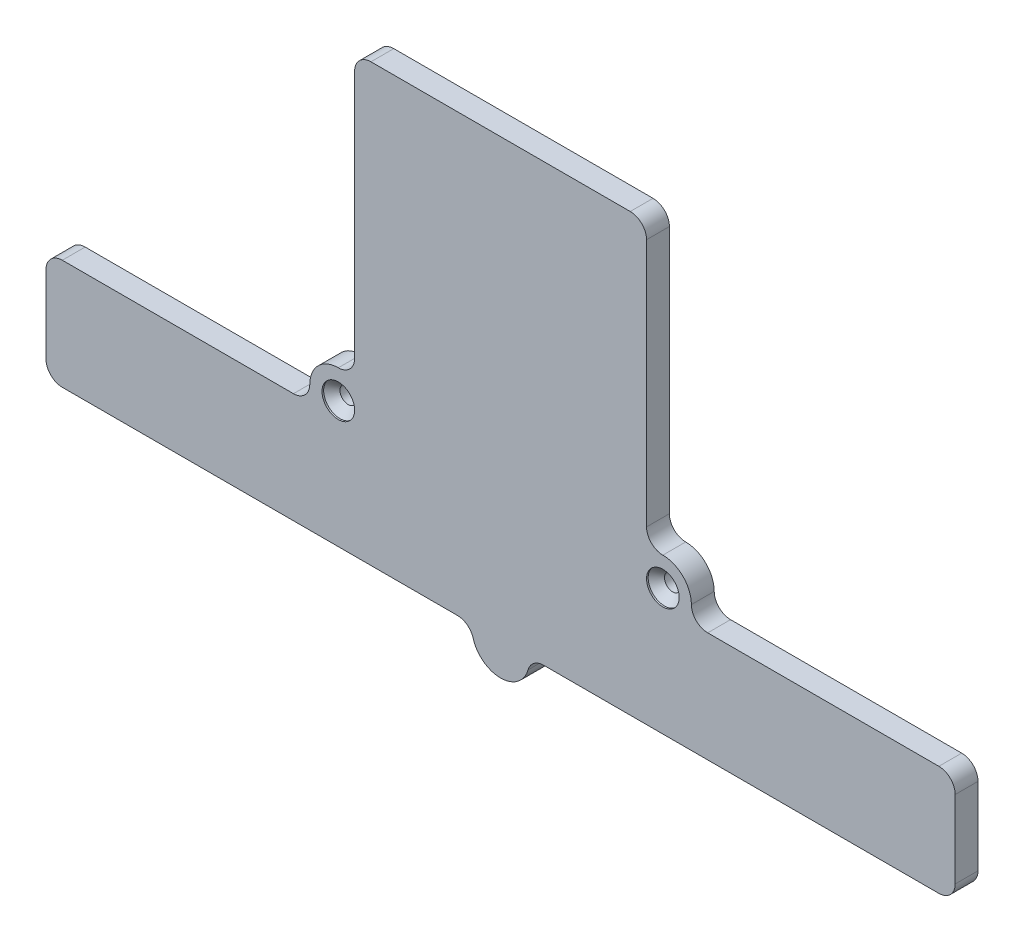
ISO-10303-21;
HEADER;
FILE_DESCRIPTION(('STEP AP214'),'2;1');
FILE_NAME('part.step','',(''),(''),'','','');
FILE_SCHEMA(('AUTOMOTIVE_DESIGN { 1 0 10303 214 1 1 1 1 }'));
ENDSEC;
DATA;
#1=APPLICATION_CONTEXT('core data for automotive mechanical design processes');
#2=APPLICATION_PROTOCOL_DEFINITION('international standard','automotive_design',2000,#1);
#3=PRODUCT_CONTEXT('',#1,'mechanical');
#4=PRODUCT('Part','Part','',(#3));
#5=PRODUCT_RELATED_PRODUCT_CATEGORY('part','',(#4));
#6=PRODUCT_DEFINITION_FORMATION('','',#4);
#7=PRODUCT_DEFINITION_CONTEXT('part definition',#1,'design');
#8=PRODUCT_DEFINITION('design','',#6,#7);
#9=PRODUCT_DEFINITION_SHAPE('','',#8);
#10=(LENGTH_UNIT() NAMED_UNIT(*) SI_UNIT(.MILLI.,.METRE.));
#11=(NAMED_UNIT(*) PLANE_ANGLE_UNIT() SI_UNIT($,.RADIAN.));
#12=(NAMED_UNIT(*) SI_UNIT($,.STERADIAN.) SOLID_ANGLE_UNIT());
#13=UNCERTAINTY_MEASURE_WITH_UNIT(LENGTH_MEASURE(1.E-05),#10,'distance_accuracy_value','');
#14=(GEOMETRIC_REPRESENTATION_CONTEXT(3) GLOBAL_UNCERTAINTY_ASSIGNED_CONTEXT((#13)) GLOBAL_UNIT_ASSIGNED_CONTEXT((#10,
#11,#12)) REPRESENTATION_CONTEXT('',''));
#15=CARTESIAN_POINT('',(0.,0.,0.));
#16=DIRECTION('',(0.,0.,1.));
#17=DIRECTION('',(1.,0.,0.));
#18=AXIS2_PLACEMENT_3D('',#15,#16,#17);
#19=CARTESIAN_POINT('',(-53.75,-24.75,2.8));
#20=DIRECTION('',(0.,0.,-1.));
#21=DIRECTION('',(-1.,0.,0.));
#22=AXIS2_PLACEMENT_3D('',#19,#20,#21);
#23=CYLINDRICAL_SURFACE('',#22,2.);
#24=CARTESIAN_POINT('',(-53.75,-24.75,0.));
#25=DIRECTION('',(0.,0.,1.));
#26=DIRECTION('',(1.,0.,0.));
#27=AXIS2_PLACEMENT_3D('',#24,#25,#26);
#28=CIRCLE('',#27,2.);
#29=CARTESIAN_POINT('',(-55.75,-24.75,0.));
#30=VERTEX_POINT('',#29);
#31=CARTESIAN_POINT('',(-53.75,-26.75,0.));
#32=VERTEX_POINT('',#31);
#33=EDGE_CURVE('E235',#30,#32,#28,.T.);
#34=ORIENTED_EDGE('',*,*,#33,.T.);
#35=DIRECTION('',(0.,0.,-1.));
#36=VECTOR('',#35,1.);
#37=CARTESIAN_POINT('',(-53.75,-26.75,2.8));
#38=LINE('',#37,#36);
#39=CARTESIAN_POINT('',(-53.75,-26.75,2.8));
#40=VERTEX_POINT('',#39);
#41=EDGE_CURVE('E12',#40,#32,#38,.T.);
#42=ORIENTED_EDGE('',*,*,#41,.F.);
#43=CARTESIAN_POINT('',(-53.75,-24.75,2.8));
#44=DIRECTION('',(0.,0.,1.));
#45=DIRECTION('',(1.,0.,0.));
#46=AXIS2_PLACEMENT_3D('',#43,#44,#45);
#47=CIRCLE('',#46,2.);
#48=CARTESIAN_POINT('',(-55.75,-24.75,2.8));
#49=VERTEX_POINT('',#48);
#50=EDGE_CURVE('E285',#49,#40,#47,.T.);
#51=ORIENTED_EDGE('',*,*,#50,.F.);
#52=DIRECTION('',(0.,0.,-1.));
#53=VECTOR('',#52,1.);
#54=CARTESIAN_POINT('',(-55.75,-24.75,2.8));
#55=LINE('',#54,#53);
#56=EDGE_CURVE('E231',#49,#30,#55,.T.);
#57=ORIENTED_EDGE('',*,*,#56,.T.);
#58=EDGE_LOOP('',(#34,#42,#51,#57));
#59=FACE_BOUND('',#58,.T.);
#60=ADVANCED_FACE('F41',(#59),#23,.T.);
#61=CARTESIAN_POINT('',(-53.75,-26.75,2.8));
#62=DIRECTION('',(0.,1.,0.));
#63=DIRECTION('',(0.,0.,1.));
#64=AXIS2_PLACEMENT_3D('',#61,#62,#63);
#65=PLANE('',#64);
#66=DIRECTION('',(1.,0.,0.));
#67=VECTOR('',#66,1.);
#68=CARTESIAN_POINT('',(-53.75,-26.75,0.));
#69=LINE('',#68,#67);
#70=CARTESIAN_POINT('',(-5.29150262212917,-26.75,0.));
#71=VERTEX_POINT('',#70);
#72=EDGE_CURVE('E237',#32,#71,#69,.T.);
#73=ORIENTED_EDGE('',*,*,#72,.T.);
#74=DIRECTION('',(0.,0.,-1.));
#75=VECTOR('',#74,1.);
#76=CARTESIAN_POINT('',(-5.29150262212917,-26.75,2.8));
#77=LINE('',#76,#75);
#78=CARTESIAN_POINT('',(-5.29150262212917,-26.75,2.8));
#79=VERTEX_POINT('',#78);
#80=EDGE_CURVE('E49',#79,#71,#77,.T.);
#81=ORIENTED_EDGE('',*,*,#80,.F.);
#82=DIRECTION('',(1.,0.,0.));
#83=VECTOR('',#82,1.);
#84=CARTESIAN_POINT('',(-53.75,-26.75,2.8));
#85=LINE('',#84,#83);
#86=EDGE_CURVE('E149',#40,#79,#85,.T.);
#87=ORIENTED_EDGE('',*,*,#86,.F.);
#88=ORIENTED_EDGE('',*,*,#41,.T.);
#89=EDGE_LOOP('',(#73,#81,#87,#88));
#90=FACE_BOUND('',#89,.T.);
#91=ADVANCED_FACE('F427',(#90),#65,.F.);
#92=CARTESIAN_POINT('',(-5.29150262212917,-28.75,2.8));
#93=DIRECTION('',(0.,0.,-1.));
#94=DIRECTION('',(-1.,0.,0.));
#95=AXIS2_PLACEMENT_3D('',#92,#93,#94);
#96=CYLINDRICAL_SURFACE('',#95,2.);
#97=CARTESIAN_POINT('',(-5.29150262212917,-28.75,0.));
#98=DIRECTION('',(0.,0.,-1.));
#99=DIRECTION('',(1.,0.,0.));
#100=AXIS2_PLACEMENT_3D('',#97,#98,#99);
#101=CIRCLE('',#100,2.);
#102=CARTESIAN_POINT('',(-3.36731985044583,-28.2045454545455,0.));
#103=VERTEX_POINT('',#102);
#104=EDGE_CURVE('E241',#71,#103,#101,.T.);
#105=ORIENTED_EDGE('',*,*,#104,.T.);
#106=DIRECTION('',(0.,0.,-1.));
#107=VECTOR('',#106,1.);
#108=CARTESIAN_POINT('',(-3.36731985044583,-28.2045454545455,2.8));
#109=LINE('',#108,#107);
#110=CARTESIAN_POINT('',(-3.36731985044583,-28.2045454545455,2.8));
#111=VERTEX_POINT('',#110);
#112=EDGE_CURVE('E341',#111,#103,#109,.T.);
#113=ORIENTED_EDGE('',*,*,#112,.F.);
#114=CARTESIAN_POINT('',(-5.29150262212917,-28.75,2.8));
#115=DIRECTION('',(0.,0.,-1.));
#116=DIRECTION('',(1.,0.,0.));
#117=AXIS2_PLACEMENT_3D('',#114,#115,#116);
#118=CIRCLE('',#117,2.);
#119=EDGE_CURVE('E349',#79,#111,#118,.T.);
#120=ORIENTED_EDGE('',*,*,#119,.F.);
#121=ORIENTED_EDGE('',*,*,#80,.T.);
#122=EDGE_LOOP('',(#105,#113,#120,#121));
#123=FACE_BOUND('',#122,.T.);
#124=ADVANCED_FACE('F347',(#123),#96,.F.);
#125=CARTESIAN_POINT('',(0.,-27.25,2.8));
#126=DIRECTION('',(0.,0.,-1.));
#127=DIRECTION('',(-1.,0.,0.));
#128=AXIS2_PLACEMENT_3D('',#125,#126,#127);
#129=CYLINDRICAL_SURFACE('',#128,3.5);
#130=CARTESIAN_POINT('',(0.,-27.25,0.));
#131=DIRECTION('',(0.,0.,1.));
#132=DIRECTION('',(1.,0.,0.));
#133=AXIS2_PLACEMENT_3D('',#130,#131,#132);
#134=CIRCLE('',#133,3.5);
#135=CARTESIAN_POINT('',(3.36731985044585,-28.2045454545455,0.));
#136=VERTEX_POINT('',#135);
#137=EDGE_CURVE('E244',#103,#136,#134,.T.);
#138=ORIENTED_EDGE('',*,*,#137,.T.);
#139=DIRECTION('',(0.,0.,-1.));
#140=VECTOR('',#139,1.);
#141=CARTESIAN_POINT('',(3.36731985044585,-28.2045454545455,2.8));
#142=LINE('',#141,#140);
#143=CARTESIAN_POINT('',(3.36731985044585,-28.2045454545455,2.8));
#144=VERTEX_POINT('',#143);
#145=EDGE_CURVE('E338',#144,#136,#142,.T.);
#146=ORIENTED_EDGE('',*,*,#145,.F.);
#147=CARTESIAN_POINT('',(0.,-27.25,2.8));
#148=DIRECTION('',(0.,0.,1.));
#149=DIRECTION('',(1.,0.,0.));
#150=AXIS2_PLACEMENT_3D('',#147,#148,#149);
#151=CIRCLE('',#150,3.5);
#152=EDGE_CURVE('E367',#111,#144,#151,.T.);
#153=ORIENTED_EDGE('',*,*,#152,.F.);
#154=ORIENTED_EDGE('',*,*,#112,.T.);
#155=EDGE_LOOP('',(#138,#146,#153,#154));
#156=FACE_BOUND('',#155,.T.);
#157=ADVANCED_FACE('F358',(#156),#129,.T.);
#158=CARTESIAN_POINT('',(5.29150262212919,-28.75,2.8));
#159=DIRECTION('',(0.,0.,-1.));
#160=DIRECTION('',(-1.,0.,0.));
#161=AXIS2_PLACEMENT_3D('',#158,#159,#160);
#162=CYLINDRICAL_SURFACE('',#161,2.);
#163=CARTESIAN_POINT('',(5.29150262212919,-28.75,0.));
#164=DIRECTION('',(0.,0.,-1.));
#165=DIRECTION('',(1.,0.,0.));
#166=AXIS2_PLACEMENT_3D('',#163,#164,#165);
#167=CIRCLE('',#166,2.);
#168=CARTESIAN_POINT('',(5.29150262212919,-26.75,0.));
#169=VERTEX_POINT('',#168);
#170=EDGE_CURVE('E246',#136,#169,#167,.T.);
#171=ORIENTED_EDGE('',*,*,#170,.T.);
#172=DIRECTION('',(0.,0.,-1.));
#173=VECTOR('',#172,1.);
#174=CARTESIAN_POINT('',(5.29150262212919,-26.75,2.8));
#175=LINE('',#174,#173);
#176=CARTESIAN_POINT('',(5.29150262212919,-26.75,2.8));
#177=VERTEX_POINT('',#176);
#178=EDGE_CURVE('E335',#177,#169,#175,.T.);
#179=ORIENTED_EDGE('',*,*,#178,.F.);
#180=CARTESIAN_POINT('',(5.29150262212919,-28.75,2.8));
#181=DIRECTION('',(0.,0.,-1.));
#182=DIRECTION('',(1.,0.,0.));
#183=AXIS2_PLACEMENT_3D('',#180,#181,#182);
#184=CIRCLE('',#183,2.);
#185=EDGE_CURVE('E364',#144,#177,#184,.T.);
#186=ORIENTED_EDGE('',*,*,#185,.F.);
#187=ORIENTED_EDGE('',*,*,#145,.T.);
#188=EDGE_LOOP('',(#171,#179,#186,#187));
#189=FACE_BOUND('',#188,.T.);
#190=ADVANCED_FACE('F362',(#189),#162,.F.);
#191=CARTESIAN_POINT('',(5.29150262212919,-26.75,2.8));
#192=DIRECTION('',(0.,1.,0.));
#193=DIRECTION('',(0.,0.,1.));
#194=AXIS2_PLACEMENT_3D('',#191,#192,#193);
#195=PLANE('',#194);
#196=DIRECTION('',(1.,0.,0.));
#197=VECTOR('',#196,1.);
#198=CARTESIAN_POINT('',(5.29150262212919,-26.75,0.));
#199=LINE('',#198,#197);
#200=CARTESIAN_POINT('',(53.75,-26.75,0.));
#201=VERTEX_POINT('',#200);
#202=EDGE_CURVE('E248',#169,#201,#199,.T.);
#203=ORIENTED_EDGE('',*,*,#202,.T.);
#204=DIRECTION('',(0.,0.,-1.));
#205=VECTOR('',#204,1.);
#206=CARTESIAN_POINT('',(53.75,-26.75,2.8));
#207=LINE('',#206,#205);
#208=CARTESIAN_POINT('',(53.75,-26.75,2.8));
#209=VERTEX_POINT('',#208);
#210=EDGE_CURVE('E332',#209,#201,#207,.T.);
#211=ORIENTED_EDGE('',*,*,#210,.F.);
#212=DIRECTION('',(1.,0.,0.));
#213=VECTOR('',#212,1.);
#214=CARTESIAN_POINT('',(5.29150262212919,-26.75,2.8));
#215=LINE('',#214,#213);
#216=EDGE_CURVE('E366',#177,#209,#215,.T.);
#217=ORIENTED_EDGE('',*,*,#216,.F.);
#218=ORIENTED_EDGE('',*,*,#178,.T.);
#219=EDGE_LOOP('',(#203,#211,#217,#218));
#220=FACE_BOUND('',#219,.T.);
#221=ADVANCED_FACE('F440',(#220),#195,.F.);
#222=CARTESIAN_POINT('',(53.75,-24.75,2.8));
#223=DIRECTION('',(0.,0.,-1.));
#224=DIRECTION('',(-1.,0.,0.));
#225=AXIS2_PLACEMENT_3D('',#222,#223,#224);
#226=CYLINDRICAL_SURFACE('',#225,2.);
#227=CARTESIAN_POINT('',(53.75,-24.75,0.));
#228=DIRECTION('',(0.,0.,1.));
#229=DIRECTION('',(1.,0.,0.));
#230=AXIS2_PLACEMENT_3D('',#227,#228,#229);
#231=CIRCLE('',#230,2.);
#232=CARTESIAN_POINT('',(55.75,-24.75,0.));
#233=VERTEX_POINT('',#232);
#234=EDGE_CURVE('E250',#201,#233,#231,.T.);
#235=ORIENTED_EDGE('',*,*,#234,.T.);
#236=DIRECTION('',(0.,0.,-1.));
#237=VECTOR('',#236,1.);
#238=CARTESIAN_POINT('',(55.75,-24.75,2.8));
#239=LINE('',#238,#237);
#240=CARTESIAN_POINT('',(55.75,-24.75,2.8));
#241=VERTEX_POINT('',#240);
#242=EDGE_CURVE('E329',#241,#233,#239,.T.);
#243=ORIENTED_EDGE('',*,*,#242,.F.);
#244=CARTESIAN_POINT('',(53.75,-24.75,2.8));
#245=DIRECTION('',(0.,0.,1.));
#246=DIRECTION('',(1.,0.,0.));
#247=AXIS2_PLACEMENT_3D('',#244,#245,#246);
#248=CIRCLE('',#247,2.);
#249=EDGE_CURVE('E369',#209,#241,#248,.T.);
#250=ORIENTED_EDGE('',*,*,#249,.F.);
#251=ORIENTED_EDGE('',*,*,#210,.T.);
#252=EDGE_LOOP('',(#235,#243,#250,#251));
#253=FACE_BOUND('',#252,.T.);
#254=ADVANCED_FACE('F443',(#253),#226,.T.);
#255=CARTESIAN_POINT('',(55.75,-24.75,2.8));
#256=DIRECTION('',(-1.,0.,0.));
#257=DIRECTION('',(0.,0.,1.));
#258=AXIS2_PLACEMENT_3D('',#255,#256,#257);
#259=PLANE('',#258);
#260=DIRECTION('',(0.,1.,0.));
#261=VECTOR('',#260,1.);
#262=CARTESIAN_POINT('',(55.75,-24.75,0.));
#263=LINE('',#262,#261);
#264=CARTESIAN_POINT('',(55.75,-15.25,0.));
#265=VERTEX_POINT('',#264);
#266=EDGE_CURVE('E252',#233,#265,#263,.T.);
#267=ORIENTED_EDGE('',*,*,#266,.T.);
#268=DIRECTION('',(0.,0.,-1.));
#269=VECTOR('',#268,1.);
#270=CARTESIAN_POINT('',(55.75,-15.25,2.8));
#271=LINE('',#270,#269);
#272=CARTESIAN_POINT('',(55.75,-15.25,2.8));
#273=VERTEX_POINT('',#272);
#274=EDGE_CURVE('E326',#273,#265,#271,.T.);
#275=ORIENTED_EDGE('',*,*,#274,.F.);
#276=DIRECTION('',(0.,1.,0.));
#277=VECTOR('',#276,1.);
#278=CARTESIAN_POINT('',(55.75,-24.75,2.8));
#279=LINE('',#278,#277);
#280=EDGE_CURVE('E375',#241,#273,#279,.T.);
#281=ORIENTED_EDGE('',*,*,#280,.F.);
#282=ORIENTED_EDGE('',*,*,#242,.T.);
#283=EDGE_LOOP('',(#267,#275,#281,#282));
#284=FACE_BOUND('',#283,.T.);
#285=ADVANCED_FACE('F447',(#284),#259,.F.);
#286=CARTESIAN_POINT('',(53.75,-15.25,2.8));
#287=DIRECTION('',(0.,0.,-1.));
#288=DIRECTION('',(-1.,0.,0.));
#289=AXIS2_PLACEMENT_3D('',#286,#287,#288);
#290=CYLINDRICAL_SURFACE('',#289,2.);
#291=CARTESIAN_POINT('',(53.75,-15.25,0.));
#292=DIRECTION('',(0.,0.,1.));
#293=DIRECTION('',(1.,0.,0.));
#294=AXIS2_PLACEMENT_3D('',#291,#292,#293);
#295=CIRCLE('',#294,2.);
#296=CARTESIAN_POINT('',(53.75,-13.25,0.));
#297=VERTEX_POINT('',#296);
#298=EDGE_CURVE('E254',#265,#297,#295,.T.);
#299=ORIENTED_EDGE('',*,*,#298,.T.);
#300=DIRECTION('',(0.,0.,-1.));
#301=VECTOR('',#300,1.);
#302=CARTESIAN_POINT('',(53.75,-13.25,2.8));
#303=LINE('',#302,#301);
#304=CARTESIAN_POINT('',(53.75,-13.25,2.8));
#305=VERTEX_POINT('',#304);
#306=EDGE_CURVE('E323',#305,#297,#303,.T.);
#307=ORIENTED_EDGE('',*,*,#306,.F.);
#308=CARTESIAN_POINT('',(53.75,-15.25,2.8));
#309=DIRECTION('',(0.,0.,1.));
#310=DIRECTION('',(1.,0.,0.));
#311=AXIS2_PLACEMENT_3D('',#308,#309,#310);
#312=CIRCLE('',#311,2.);
#313=EDGE_CURVE('E377',#273,#305,#312,.T.);
#314=ORIENTED_EDGE('',*,*,#313,.F.);
#315=ORIENTED_EDGE('',*,*,#274,.T.);
#316=EDGE_LOOP('',(#299,#307,#314,#315));
#317=FACE_BOUND('',#316,.T.);
#318=ADVANCED_FACE('F451',(#317),#290,.T.);
#319=CARTESIAN_POINT('',(53.75,-13.25,2.8));
#320=DIRECTION('',(0.,-1.,0.));
#321=DIRECTION('',(1.,0.,0.));
#322=AXIS2_PLACEMENT_3D('',#319,#320,#321);
#323=PLANE('',#322);
#324=DIRECTION('',(-1.,0.,0.));
#325=VECTOR('',#324,1.);
#326=CARTESIAN_POINT('',(53.75,-13.25,0.));
#327=LINE('',#326,#325);
#328=CARTESIAN_POINT('',(25.4,-13.25,0.));
#329=VERTEX_POINT('',#328);
#330=EDGE_CURVE('E256',#297,#329,#327,.T.);
#331=ORIENTED_EDGE('',*,*,#330,.T.);
#332=DIRECTION('',(0.,0.,-1.));
#333=VECTOR('',#332,1.);
#334=CARTESIAN_POINT('',(25.4,-13.25,2.8));
#335=LINE('',#334,#333);
#336=CARTESIAN_POINT('',(25.4,-13.25,2.8));
#337=VERTEX_POINT('',#336);
#338=EDGE_CURVE('E320',#337,#329,#335,.T.);
#339=ORIENTED_EDGE('',*,*,#338,.F.);
#340=DIRECTION('',(-1.,0.,0.));
#341=VECTOR('',#340,1.);
#342=CARTESIAN_POINT('',(53.75,-13.25,2.8));
#343=LINE('',#342,#341);
#344=EDGE_CURVE('E379',#305,#337,#343,.T.);
#345=ORIENTED_EDGE('',*,*,#344,.F.);
#346=ORIENTED_EDGE('',*,*,#306,.T.);
#347=EDGE_LOOP('',(#331,#339,#345,#346));
#348=FACE_BOUND('',#347,.T.);
#349=ADVANCED_FACE('F455',(#348),#323,.F.);
#350=CARTESIAN_POINT('',(25.4,-11.25,2.8));
#351=DIRECTION('',(0.,0.,-1.));
#352=DIRECTION('',(-1.,0.,0.));
#353=AXIS2_PLACEMENT_3D('',#350,#351,#352);
#354=CYLINDRICAL_SURFACE('',#353,2.);
#355=CARTESIAN_POINT('',(25.4,-11.25,0.));
#356=DIRECTION('',(0.,0.,-1.));
#357=DIRECTION('',(1.,0.,0.));
#358=AXIS2_PLACEMENT_3D('',#355,#356,#357);
#359=CIRCLE('',#358,2.);
#360=CARTESIAN_POINT('',(23.4,-11.25,0.));
#361=VERTEX_POINT('',#360);
#362=EDGE_CURVE('E258',#329,#361,#359,.T.);
#363=ORIENTED_EDGE('',*,*,#362,.T.);
#364=DIRECTION('',(0.,0.,-1.));
#365=VECTOR('',#364,1.);
#366=CARTESIAN_POINT('',(23.4,-11.25,2.8));
#367=LINE('',#366,#365);
#368=CARTESIAN_POINT('',(23.4,-11.25,2.8));
#369=VERTEX_POINT('',#368);
#370=EDGE_CURVE('E317',#369,#361,#367,.T.);
#371=ORIENTED_EDGE('',*,*,#370,.F.);
#372=CARTESIAN_POINT('',(25.4,-11.25,2.8));
#373=DIRECTION('',(0.,0.,-1.));
#374=DIRECTION('',(1.,0.,0.));
#375=AXIS2_PLACEMENT_3D('',#372,#373,#374);
#376=CIRCLE('',#375,2.);
#377=EDGE_CURVE('E381',#337,#369,#376,.T.);
#378=ORIENTED_EDGE('',*,*,#377,.F.);
#379=ORIENTED_EDGE('',*,*,#338,.T.);
#380=EDGE_LOOP('',(#363,#371,#378,#379));
#381=FACE_BOUND('',#380,.T.);
#382=ADVANCED_FACE('F459',(#381),#354,.F.);
#383=CARTESIAN_POINT('',(19.9,-11.25,2.8));
#384=DIRECTION('',(0.,0.,-1.));
#385=DIRECTION('',(-1.,0.,0.));
#386=AXIS2_PLACEMENT_3D('',#383,#384,#385);
#387=CYLINDRICAL_SURFACE('',#386,3.50000000000001);
#388=CARTESIAN_POINT('',(19.9,-11.25,0.));
#389=DIRECTION('',(0.,0.,1.));
#390=DIRECTION('',(1.,0.,0.));
#391=AXIS2_PLACEMENT_3D('',#388,#389,#390);
#392=CIRCLE('',#391,3.50000000000001);
#393=CARTESIAN_POINT('',(19.9,-7.74999999999999,0.));
#394=VERTEX_POINT('',#393);
#395=EDGE_CURVE('E260',#361,#394,#392,.T.);
#396=ORIENTED_EDGE('',*,*,#395,.T.);
#397=DIRECTION('',(0.,0.,-1.));
#398=VECTOR('',#397,1.);
#399=CARTESIAN_POINT('',(19.9,-7.74999999999999,2.8));
#400=LINE('',#399,#398);
#401=CARTESIAN_POINT('',(19.9,-7.74999999999999,2.8));
#402=VERTEX_POINT('',#401);
#403=EDGE_CURVE('E314',#402,#394,#400,.T.);
#404=ORIENTED_EDGE('',*,*,#403,.F.);
#405=CARTESIAN_POINT('',(19.9,-11.25,2.8));
#406=DIRECTION('',(0.,0.,1.));
#407=DIRECTION('',(1.,0.,0.));
#408=AXIS2_PLACEMENT_3D('',#405,#406,#407);
#409=CIRCLE('',#408,3.50000000000001);
#410=EDGE_CURVE('E383',#369,#402,#409,.T.);
#411=ORIENTED_EDGE('',*,*,#410,.F.);
#412=ORIENTED_EDGE('',*,*,#370,.T.);
#413=EDGE_LOOP('',(#396,#404,#411,#412));
#414=FACE_BOUND('',#413,.T.);
#415=ADVANCED_FACE('F463',(#414),#387,.T.);
#416=CARTESIAN_POINT('',(19.9,-5.75,2.8));
#417=DIRECTION('',(0.,0.,-1.));
#418=DIRECTION('',(-1.,0.,0.));
#419=AXIS2_PLACEMENT_3D('',#416,#417,#418);
#420=CYLINDRICAL_SURFACE('',#419,2.);
#421=CARTESIAN_POINT('',(19.9,-5.75,0.));
#422=DIRECTION('',(0.,0.,-1.));
#423=DIRECTION('',(1.,0.,0.));
#424=AXIS2_PLACEMENT_3D('',#421,#422,#423);
#425=CIRCLE('',#424,2.);
#426=CARTESIAN_POINT('',(17.9,-5.75000000000001,0.));
#427=VERTEX_POINT('',#426);
#428=EDGE_CURVE('E262',#394,#427,#425,.T.);
#429=ORIENTED_EDGE('',*,*,#428,.T.);
#430=DIRECTION('',(0.,0.,-1.));
#431=VECTOR('',#430,1.);
#432=CARTESIAN_POINT('',(17.9,-5.75000000000001,2.8));
#433=LINE('',#432,#431);
#434=CARTESIAN_POINT('',(17.9,-5.75000000000001,2.8));
#435=VERTEX_POINT('',#434);
#436=EDGE_CURVE('E310',#435,#427,#433,.T.);
#437=ORIENTED_EDGE('',*,*,#436,.F.);
#438=CARTESIAN_POINT('',(19.9,-5.75,2.8));
#439=DIRECTION('',(0.,0.,-1.));
#440=DIRECTION('',(1.,0.,0.));
#441=AXIS2_PLACEMENT_3D('',#438,#439,#440);
#442=CIRCLE('',#441,2.);
#443=EDGE_CURVE('E385',#402,#435,#442,.T.);
#444=ORIENTED_EDGE('',*,*,#443,.F.);
#445=ORIENTED_EDGE('',*,*,#403,.T.);
#446=EDGE_LOOP('',(#429,#437,#444,#445));
#447=FACE_BOUND('',#446,.T.);
#448=ADVANCED_FACE('F467',(#447),#420,.F.);
#449=CARTESIAN_POINT('',(17.9,-5.75000000000001,2.8));
#450=DIRECTION('',(-1.,0.,0.));
#451=DIRECTION('',(0.,0.,1.));
#452=AXIS2_PLACEMENT_3D('',#449,#450,#451);
#453=PLANE('',#452);
#454=DIRECTION('',(0.,1.,0.));
#455=VECTOR('',#454,1.);
#456=CARTESIAN_POINT('',(17.9,-5.75000000000001,0.));
#457=LINE('',#456,#455);
#458=CARTESIAN_POINT('',(17.9,24.75,0.));
#459=VERTEX_POINT('',#458);
#460=EDGE_CURVE('E265',#427,#459,#457,.T.);
#461=ORIENTED_EDGE('',*,*,#460,.T.);
#462=DIRECTION('',(0.,0.,-1.));
#463=VECTOR('',#462,1.);
#464=CARTESIAN_POINT('',(17.9,24.75,2.8));
#465=LINE('',#464,#463);
#466=CARTESIAN_POINT('',(17.9,24.75,2.8));
#467=VERTEX_POINT('',#466);
#468=EDGE_CURVE('E307',#467,#459,#465,.T.);
#469=ORIENTED_EDGE('',*,*,#468,.F.);
#470=DIRECTION('',(0.,1.,0.));
#471=VECTOR('',#470,1.);
#472=CARTESIAN_POINT('',(17.9,-5.75000000000001,2.8));
#473=LINE('',#472,#471);
#474=EDGE_CURVE('E388',#435,#467,#473,.T.);
#475=ORIENTED_EDGE('',*,*,#474,.F.);
#476=ORIENTED_EDGE('',*,*,#436,.T.);
#477=EDGE_LOOP('',(#461,#469,#475,#476));
#478=FACE_BOUND('',#477,.T.);
#479=ADVANCED_FACE('F471',(#478),#453,.F.);
#480=CARTESIAN_POINT('',(15.9,24.75,2.8));
#481=DIRECTION('',(0.,0.,-1.));
#482=DIRECTION('',(-1.,0.,0.));
#483=AXIS2_PLACEMENT_3D('',#480,#481,#482);
#484=CYLINDRICAL_SURFACE('',#483,2.);
#485=CARTESIAN_POINT('',(15.9,24.75,0.));
#486=DIRECTION('',(0.,0.,1.));
#487=DIRECTION('',(1.,0.,0.));
#488=AXIS2_PLACEMENT_3D('',#485,#486,#487);
#489=CIRCLE('',#488,2.);
#490=CARTESIAN_POINT('',(15.9,26.75,0.));
#491=VERTEX_POINT('',#490);
#492=EDGE_CURVE('E268',#459,#491,#489,.T.);
#493=ORIENTED_EDGE('',*,*,#492,.T.);
#494=DIRECTION('',(0.,0.,-1.));
#495=VECTOR('',#494,1.);
#496=CARTESIAN_POINT('',(15.9,26.75,2.8));
#497=LINE('',#496,#495);
#498=CARTESIAN_POINT('',(15.9,26.75,2.8));
#499=VERTEX_POINT('',#498);
#500=EDGE_CURVE('E304',#499,#491,#497,.T.);
#501=ORIENTED_EDGE('',*,*,#500,.F.);
#502=CARTESIAN_POINT('',(15.9,24.75,2.8));
#503=DIRECTION('',(0.,0.,1.));
#504=DIRECTION('',(1.,0.,0.));
#505=AXIS2_PLACEMENT_3D('',#502,#503,#504);
#506=CIRCLE('',#505,2.);
#507=EDGE_CURVE('E391',#467,#499,#506,.T.);
#508=ORIENTED_EDGE('',*,*,#507,.F.);
#509=ORIENTED_EDGE('',*,*,#468,.T.);
#510=EDGE_LOOP('',(#493,#501,#508,#509));
#511=FACE_BOUND('',#510,.T.);
#512=ADVANCED_FACE('F475',(#511),#484,.T.);
#513=CARTESIAN_POINT('',(15.9,26.75,2.8));
#514=DIRECTION('',(0.,-1.,0.));
#515=DIRECTION('',(0.,0.,-1.));
#516=AXIS2_PLACEMENT_3D('',#513,#514,#515);
#517=PLANE('',#516);
#518=DIRECTION('',(-1.,0.,0.));
#519=VECTOR('',#518,1.);
#520=CARTESIAN_POINT('',(15.9,26.75,0.));
#521=LINE('',#520,#519);
#522=CARTESIAN_POINT('',(-15.9,26.75,0.));
#523=VERTEX_POINT('',#522);
#524=EDGE_CURVE('E270',#491,#523,#521,.T.);
#525=ORIENTED_EDGE('',*,*,#524,.T.);
#526=DIRECTION('',(0.,0.,-1.));
#527=VECTOR('',#526,1.);
#528=CARTESIAN_POINT('',(-15.9,26.75,2.8));
#529=LINE('',#528,#527);
#530=CARTESIAN_POINT('',(-15.9,26.75,2.8));
#531=VERTEX_POINT('',#530);
#532=EDGE_CURVE('E301',#531,#523,#529,.T.);
#533=ORIENTED_EDGE('',*,*,#532,.F.);
#534=DIRECTION('',(-1.,0.,0.));
#535=VECTOR('',#534,1.);
#536=CARTESIAN_POINT('',(15.9,26.75,2.8));
#537=LINE('',#536,#535);
#538=EDGE_CURVE('E393',#499,#531,#537,.T.);
#539=ORIENTED_EDGE('',*,*,#538,.F.);
#540=ORIENTED_EDGE('',*,*,#500,.T.);
#541=EDGE_LOOP('',(#525,#533,#539,#540));
#542=FACE_BOUND('',#541,.T.);
#543=ADVANCED_FACE('F479',(#542),#517,.F.);
#544=CARTESIAN_POINT('',(-15.9,24.75,2.8));
#545=DIRECTION('',(0.,0.,-1.));
#546=DIRECTION('',(-1.,0.,0.));
#547=AXIS2_PLACEMENT_3D('',#544,#545,#546);
#548=CYLINDRICAL_SURFACE('',#547,2.);
#549=CARTESIAN_POINT('',(-15.9,24.75,0.));
#550=DIRECTION('',(0.,0.,1.));
#551=DIRECTION('',(1.,0.,0.));
#552=AXIS2_PLACEMENT_3D('',#549,#550,#551);
#553=CIRCLE('',#552,2.);
#554=CARTESIAN_POINT('',(-17.9,24.75,0.));
#555=VERTEX_POINT('',#554);
#556=EDGE_CURVE('E272',#523,#555,#553,.T.);
#557=ORIENTED_EDGE('',*,*,#556,.T.);
#558=DIRECTION('',(0.,0.,-1.));
#559=VECTOR('',#558,1.);
#560=CARTESIAN_POINT('',(-17.9,24.75,2.8));
#561=LINE('',#560,#559);
#562=CARTESIAN_POINT('',(-17.9,24.75,2.8));
#563=VERTEX_POINT('',#562);
#564=EDGE_CURVE('E298',#563,#555,#561,.T.);
#565=ORIENTED_EDGE('',*,*,#564,.F.);
#566=CARTESIAN_POINT('',(-15.9,24.75,2.8));
#567=DIRECTION('',(0.,0.,1.));
#568=DIRECTION('',(1.,0.,0.));
#569=AXIS2_PLACEMENT_3D('',#566,#567,#568);
#570=CIRCLE('',#569,2.);
#571=EDGE_CURVE('E395',#531,#563,#570,.T.);
#572=ORIENTED_EDGE('',*,*,#571,.F.);
#573=ORIENTED_EDGE('',*,*,#532,.T.);
#574=EDGE_LOOP('',(#557,#565,#572,#573));
#575=FACE_BOUND('',#574,.T.);
#576=ADVANCED_FACE('F483',(#575),#548,.T.);
#577=CARTESIAN_POINT('',(-17.9,24.75,2.8));
#578=DIRECTION('',(1.,0.,0.));
#579=DIRECTION('',(0.,0.,-1.));
#580=AXIS2_PLACEMENT_3D('',#577,#578,#579);
#581=PLANE('',#580);
#582=DIRECTION('',(0.,-1.,0.));
#583=VECTOR('',#582,1.);
#584=CARTESIAN_POINT('',(-17.9,24.75,0.));
#585=LINE('',#584,#583);
#586=CARTESIAN_POINT('',(-17.9,-5.75000000000001,0.));
#587=VERTEX_POINT('',#586);
#588=EDGE_CURVE('E274',#555,#587,#585,.T.);
#589=ORIENTED_EDGE('',*,*,#588,.T.);
#590=DIRECTION('',(0.,0.,-1.));
#591=VECTOR('',#590,1.);
#592=CARTESIAN_POINT('',(-17.9,-5.75000000000001,2.8));
#593=LINE('',#592,#591);
#594=CARTESIAN_POINT('',(-17.9,-5.75000000000001,2.8));
#595=VERTEX_POINT('',#594);
#596=EDGE_CURVE('E295',#595,#587,#593,.T.);
#597=ORIENTED_EDGE('',*,*,#596,.F.);
#598=DIRECTION('',(0.,-1.,0.));
#599=VECTOR('',#598,1.);
#600=CARTESIAN_POINT('',(-17.9,24.75,2.8));
#601=LINE('',#600,#599);
#602=EDGE_CURVE('E397',#563,#595,#601,.T.);
#603=ORIENTED_EDGE('',*,*,#602,.F.);
#604=ORIENTED_EDGE('',*,*,#564,.T.);
#605=EDGE_LOOP('',(#589,#597,#603,#604));
#606=FACE_BOUND('',#605,.T.);
#607=ADVANCED_FACE('F487',(#606),#581,.F.);
#608=CARTESIAN_POINT('',(-19.9,-5.75000000000001,2.8));
#609=DIRECTION('',(0.,0.,-1.));
#610=DIRECTION('',(-1.,0.,0.));
#611=AXIS2_PLACEMENT_3D('',#608,#609,#610);
#612=CYLINDRICAL_SURFACE('',#611,2.);
#613=CARTESIAN_POINT('',(-19.9,-5.75000000000001,0.));
#614=DIRECTION('',(0.,0.,-1.));
#615=DIRECTION('',(1.,0.,0.));
#616=AXIS2_PLACEMENT_3D('',#613,#614,#615);
#617=CIRCLE('',#616,2.);
#618=CARTESIAN_POINT('',(-19.9,-7.75000000000001,0.));
#619=VERTEX_POINT('',#618);
#620=EDGE_CURVE('E276',#587,#619,#617,.T.);
#621=ORIENTED_EDGE('',*,*,#620,.T.);
#622=DIRECTION('',(0.,0.,-1.));
#623=VECTOR('',#622,1.);
#624=CARTESIAN_POINT('',(-19.9,-7.75000000000001,2.8));
#625=LINE('',#624,#623);
#626=CARTESIAN_POINT('',(-19.9,-7.75000000000001,2.8));
#627=VERTEX_POINT('',#626);
#628=EDGE_CURVE('E292',#627,#619,#625,.T.);
#629=ORIENTED_EDGE('',*,*,#628,.F.);
#630=CARTESIAN_POINT('',(-19.9,-5.75000000000001,2.8));
#631=DIRECTION('',(0.,0.,-1.));
#632=DIRECTION('',(1.,0.,0.));
#633=AXIS2_PLACEMENT_3D('',#630,#631,#632);
#634=CIRCLE('',#633,2.);
#635=EDGE_CURVE('E399',#595,#627,#634,.T.);
#636=ORIENTED_EDGE('',*,*,#635,.F.);
#637=ORIENTED_EDGE('',*,*,#596,.T.);
#638=EDGE_LOOP('',(#621,#629,#636,#637));
#639=FACE_BOUND('',#638,.T.);
#640=ADVANCED_FACE('F491',(#639),#612,.F.);
#641=CARTESIAN_POINT('',(-19.9,-11.25,2.8));
#642=DIRECTION('',(0.,0.,-1.));
#643=DIRECTION('',(-1.,0.,0.));
#644=AXIS2_PLACEMENT_3D('',#641,#642,#643);
#645=CYLINDRICAL_SURFACE('',#644,3.5);
#646=CARTESIAN_POINT('',(-19.9,-11.25,0.));
#647=DIRECTION('',(0.,0.,1.));
#648=DIRECTION('',(1.,0.,0.));
#649=AXIS2_PLACEMENT_3D('',#646,#647,#648);
#650=CIRCLE('',#649,3.5);
#651=CARTESIAN_POINT('',(-23.4,-11.25,0.));
#652=VERTEX_POINT('',#651);
#653=EDGE_CURVE('E278',#619,#652,#650,.T.);
#654=ORIENTED_EDGE('',*,*,#653,.T.);
#655=DIRECTION('',(0.,0.,-1.));
#656=VECTOR('',#655,1.);
#657=CARTESIAN_POINT('',(-23.4,-11.25,2.8));
#658=LINE('',#657,#656);
#659=CARTESIAN_POINT('',(-23.4,-11.25,2.8));
#660=VERTEX_POINT('',#659);
#661=EDGE_CURVE('E289',#660,#652,#658,.T.);
#662=ORIENTED_EDGE('',*,*,#661,.F.);
#663=CARTESIAN_POINT('',(-19.9,-11.25,2.8));
#664=DIRECTION('',(0.,0.,1.));
#665=DIRECTION('',(1.,0.,0.));
#666=AXIS2_PLACEMENT_3D('',#663,#664,#665);
#667=CIRCLE('',#666,3.5);
#668=EDGE_CURVE('E401',#627,#660,#667,.T.);
#669=ORIENTED_EDGE('',*,*,#668,.F.);
#670=ORIENTED_EDGE('',*,*,#628,.T.);
#671=EDGE_LOOP('',(#654,#662,#669,#670));
#672=FACE_BOUND('',#671,.T.);
#673=ADVANCED_FACE('F407',(#672),#645,.T.);
#674=CARTESIAN_POINT('',(-25.4,-11.25,2.8));
#675=DIRECTION('',(0.,0.,-1.));
#676=DIRECTION('',(-1.,0.,0.));
#677=AXIS2_PLACEMENT_3D('',#674,#675,#676);
#678=CYLINDRICAL_SURFACE('',#677,2.);
#679=CARTESIAN_POINT('',(-25.4,-11.25,0.));
#680=DIRECTION('',(0.,0.,-1.));
#681=DIRECTION('',(1.,0.,0.));
#682=AXIS2_PLACEMENT_3D('',#679,#680,#681);
#683=CIRCLE('',#682,2.);
#684=CARTESIAN_POINT('',(-25.4,-13.25,0.));
#685=VERTEX_POINT('',#684);
#686=EDGE_CURVE('E280',#652,#685,#683,.T.);
#687=ORIENTED_EDGE('',*,*,#686,.T.);
#688=DIRECTION('',(0.,0.,-1.));
#689=VECTOR('',#688,1.);
#690=CARTESIAN_POINT('',(-25.4,-13.25,2.8));
#691=LINE('',#690,#689);
#692=CARTESIAN_POINT('',(-25.4,-13.25,2.8));
#693=VERTEX_POINT('',#692);
#694=EDGE_CURVE('E226',#693,#685,#691,.T.);
#695=ORIENTED_EDGE('',*,*,#694,.F.);
#696=CARTESIAN_POINT('',(-25.4,-11.25,2.8));
#697=DIRECTION('',(0.,0.,-1.));
#698=DIRECTION('',(1.,0.,0.));
#699=AXIS2_PLACEMENT_3D('',#696,#697,#698);
#700=CIRCLE('',#699,2.);
#701=EDGE_CURVE('E217',#660,#693,#700,.T.);
#702=ORIENTED_EDGE('',*,*,#701,.F.);
#703=ORIENTED_EDGE('',*,*,#661,.T.);
#704=EDGE_LOOP('',(#687,#695,#702,#703));
#705=FACE_BOUND('',#704,.T.);
#706=ADVANCED_FACE('F411',(#705),#678,.F.);
#707=CARTESIAN_POINT('',(-25.4,-13.25,2.8));
#708=DIRECTION('',(0.,-1.,0.));
#709=DIRECTION('',(0.,0.,-1.));
#710=AXIS2_PLACEMENT_3D('',#707,#708,#709);
#711=PLANE('',#710);
#712=DIRECTION('',(-1.,0.,0.));
#713=VECTOR('',#712,1.);
#714=CARTESIAN_POINT('',(-25.4,-13.25,0.));
#715=LINE('',#714,#713);
#716=CARTESIAN_POINT('',(-53.75,-13.25,0.));
#717=VERTEX_POINT('',#716);
#718=EDGE_CURVE('E225',#685,#717,#715,.T.);
#719=ORIENTED_EDGE('',*,*,#718,.T.);
#720=DIRECTION('',(0.,0.,-1.));
#721=VECTOR('',#720,1.);
#722=CARTESIAN_POINT('',(-53.75,-13.25,2.8));
#723=LINE('',#722,#721);
#724=CARTESIAN_POINT('',(-53.75,-13.25,2.8));
#725=VERTEX_POINT('',#724);
#726=EDGE_CURVE('E222',#725,#717,#723,.T.);
#727=ORIENTED_EDGE('',*,*,#726,.F.);
#728=DIRECTION('',(-1.,0.,0.));
#729=VECTOR('',#728,1.);
#730=CARTESIAN_POINT('',(-25.4,-13.25,2.8));
#731=LINE('',#730,#729);
#732=EDGE_CURVE('E211',#693,#725,#731,.T.);
#733=ORIENTED_EDGE('',*,*,#732,.F.);
#734=ORIENTED_EDGE('',*,*,#694,.T.);
#735=EDGE_LOOP('',(#719,#727,#733,#734));
#736=FACE_BOUND('',#735,.T.);
#737=ADVANCED_FACE('F223',(#736),#711,.F.);
#738=CARTESIAN_POINT('',(-53.75,-15.25,2.8));
#739=DIRECTION('',(0.,0.,-1.));
#740=DIRECTION('',(-1.,0.,0.));
#741=AXIS2_PLACEMENT_3D('',#738,#739,#740);
#742=CYLINDRICAL_SURFACE('',#741,2.);
#743=CARTESIAN_POINT('',(-53.75,-15.25,0.));
#744=DIRECTION('',(0.,0.,1.));
#745=DIRECTION('',(1.,0.,0.));
#746=AXIS2_PLACEMENT_3D('',#743,#744,#745);
#747=CIRCLE('',#746,2.);
#748=CARTESIAN_POINT('',(-55.75,-15.25,0.));
#749=VERTEX_POINT('',#748);
#750=EDGE_CURVE('E135',#717,#749,#747,.T.);
#751=ORIENTED_EDGE('',*,*,#750,.T.);
#752=DIRECTION('',(0.,0.,-1.));
#753=VECTOR('',#752,1.);
#754=CARTESIAN_POINT('',(-55.75,-15.25,2.8));
#755=LINE('',#754,#753);
#756=CARTESIAN_POINT('',(-55.75,-15.25,2.8));
#757=VERTEX_POINT('',#756);
#758=EDGE_CURVE('E227',#757,#749,#755,.T.);
#759=ORIENTED_EDGE('',*,*,#758,.F.);
#760=CARTESIAN_POINT('',(-53.75,-15.25,2.8));
#761=DIRECTION('',(0.,0.,1.));
#762=DIRECTION('',(1.,0.,0.));
#763=AXIS2_PLACEMENT_3D('',#760,#761,#762);
#764=CIRCLE('',#763,2.);
#765=EDGE_CURVE('E215',#725,#757,#764,.T.);
#766=ORIENTED_EDGE('',*,*,#765,.F.);
#767=ORIENTED_EDGE('',*,*,#726,.T.);
#768=EDGE_LOOP('',(#751,#759,#766,#767));
#769=FACE_BOUND('',#768,.T.);
#770=ADVANCED_FACE('F229',(#769),#742,.T.);
#771=CARTESIAN_POINT('',(-55.75,-15.25,2.8));
#772=DIRECTION('',(1.,0.,0.));
#773=DIRECTION('',(0.,0.,-1.));
#774=AXIS2_PLACEMENT_3D('',#771,#772,#773);
#775=PLANE('',#774);
#776=DIRECTION('',(0.,-1.,0.));
#777=VECTOR('',#776,1.);
#778=CARTESIAN_POINT('',(-55.75,-15.25,0.));
#779=LINE('',#778,#777);
#780=EDGE_CURVE('E141',#749,#30,#779,.T.);
#781=ORIENTED_EDGE('',*,*,#780,.T.);
#782=ORIENTED_EDGE('',*,*,#56,.F.);
#783=DIRECTION('',(0.,-1.,0.));
#784=VECTOR('',#783,1.);
#785=CARTESIAN_POINT('',(-55.75,-15.25,2.8));
#786=LINE('',#785,#784);
#787=EDGE_CURVE('E57',#757,#49,#786,.T.);
#788=ORIENTED_EDGE('',*,*,#787,.F.);
#789=ORIENTED_EDGE('',*,*,#758,.T.);
#790=EDGE_LOOP('',(#781,#782,#788,#789));
#791=FACE_BOUND('',#790,.T.);
#792=ADVANCED_FACE('F415',(#791),#775,.F.);
#793=CARTESIAN_POINT('',(-53.75,-24.75,2.8));
#794=DIRECTION('',(0.,0.,1.));
#795=DIRECTION('',(1.,0.,0.));
#796=AXIS2_PLACEMENT_3D('',#793,#794,#795);
#797=PLANE('',#796);
#798=CARTESIAN_POINT('',(-19.9,-11.25,2.8));
#799=DIRECTION('',(0.,0.,1.));
#800=DIRECTION('',(1.,0.,0.));
#801=AXIS2_PLACEMENT_3D('',#798,#799,#800);
#802=CIRCLE('',#801,2.);
#803=CARTESIAN_POINT('',(-17.9,-11.25,2.8));
#804=VERTEX_POINT('',#803);
#805=EDGE_CURVE('E597',#804,#804,#802,.T.);
#806=ORIENTED_EDGE('',*,*,#805,.F.);
#807=EDGE_LOOP('',(#806));
#808=FACE_BOUND('',#807,.T.);
#809=CARTESIAN_POINT('',(19.9,-11.25,2.8));
#810=DIRECTION('',(0.,0.,1.));
#811=DIRECTION('',(1.,0.,0.));
#812=AXIS2_PLACEMENT_3D('',#809,#810,#811);
#813=CIRCLE('',#812,2.);
#814=CARTESIAN_POINT('',(21.9,-11.25,2.8));
#815=VERTEX_POINT('',#814);
#816=EDGE_CURVE('E604',#815,#815,#813,.T.);
#817=ORIENTED_EDGE('',*,*,#816,.F.);
#818=EDGE_LOOP('',(#817));
#819=FACE_BOUND('',#818,.T.);
#820=ORIENTED_EDGE('',*,*,#50,.T.);
#821=ORIENTED_EDGE('',*,*,#86,.T.);
#822=ORIENTED_EDGE('',*,*,#119,.T.);
#823=ORIENTED_EDGE('',*,*,#152,.T.);
#824=ORIENTED_EDGE('',*,*,#185,.T.);
#825=ORIENTED_EDGE('',*,*,#216,.T.);
#826=ORIENTED_EDGE('',*,*,#249,.T.);
#827=ORIENTED_EDGE('',*,*,#280,.T.);
#828=ORIENTED_EDGE('',*,*,#313,.T.);
#829=ORIENTED_EDGE('',*,*,#344,.T.);
#830=ORIENTED_EDGE('',*,*,#377,.T.);
#831=ORIENTED_EDGE('',*,*,#410,.T.);
#832=ORIENTED_EDGE('',*,*,#443,.T.);
#833=ORIENTED_EDGE('',*,*,#474,.T.);
#834=ORIENTED_EDGE('',*,*,#507,.T.);
#835=ORIENTED_EDGE('',*,*,#538,.T.);
#836=ORIENTED_EDGE('',*,*,#571,.T.);
#837=ORIENTED_EDGE('',*,*,#602,.T.);
#838=ORIENTED_EDGE('',*,*,#635,.T.);
#839=ORIENTED_EDGE('',*,*,#668,.T.);
#840=ORIENTED_EDGE('',*,*,#701,.T.);
#841=ORIENTED_EDGE('',*,*,#732,.T.);
#842=ORIENTED_EDGE('',*,*,#765,.T.);
#843=ORIENTED_EDGE('',*,*,#787,.T.);
#844=EDGE_LOOP('',(#820,#821,#822,#823,#824,#825,#826,#827,#828,#829,#830,#831,#832,#833,#834,
#835,#836,#837,#838,#839,#840,#841,#842,#843));
#845=FACE_BOUND('',#844,.T.);
#846=ADVANCED_FACE('F213',(#808,#819,#845),#797,.T.);
#847=CARTESIAN_POINT('',(-53.75,-24.75,0.));
#848=DIRECTION('',(0.,0.,1.));
#849=DIRECTION('',(1.,0.,0.));
#850=AXIS2_PLACEMENT_3D('',#847,#848,#849);
#851=PLANE('',#850);
#852=CARTESIAN_POINT('',(-19.9,-11.25,0.));
#853=DIRECTION('',(0.,0.,1.));
#854=DIRECTION('',(1.,0.,0.));
#855=AXIS2_PLACEMENT_3D('',#852,#853,#854);
#856=CIRCLE('',#855,1.);
#857=CARTESIAN_POINT('',(-18.9,-11.25,0.));
#858=VERTEX_POINT('',#857);
#859=EDGE_CURVE('E238',#858,#858,#856,.F.);
#860=ORIENTED_EDGE('',*,*,#859,.F.);
#861=EDGE_LOOP('',(#860));
#862=FACE_BOUND('',#861,.T.);
#863=CARTESIAN_POINT('',(19.9,-11.25,0.));
#864=DIRECTION('',(0.,0.,1.));
#865=DIRECTION('',(1.,0.,0.));
#866=AXIS2_PLACEMENT_3D('',#863,#864,#865);
#867=CIRCLE('',#866,1.);
#868=CARTESIAN_POINT('',(20.9,-11.25,0.));
#869=VERTEX_POINT('',#868);
#870=EDGE_CURVE('E613',#869,#869,#867,.F.);
#871=ORIENTED_EDGE('',*,*,#870,.F.);
#872=EDGE_LOOP('',(#871));
#873=FACE_BOUND('',#872,.T.);
#874=ORIENTED_EDGE('',*,*,#33,.F.);
#875=ORIENTED_EDGE('',*,*,#780,.F.);
#876=ORIENTED_EDGE('',*,*,#750,.F.);
#877=ORIENTED_EDGE('',*,*,#718,.F.);
#878=ORIENTED_EDGE('',*,*,#686,.F.);
#879=ORIENTED_EDGE('',*,*,#653,.F.);
#880=ORIENTED_EDGE('',*,*,#620,.F.);
#881=ORIENTED_EDGE('',*,*,#588,.F.);
#882=ORIENTED_EDGE('',*,*,#556,.F.);
#883=ORIENTED_EDGE('',*,*,#524,.F.);
#884=ORIENTED_EDGE('',*,*,#492,.F.);
#885=ORIENTED_EDGE('',*,*,#460,.F.);
#886=ORIENTED_EDGE('',*,*,#428,.F.);
#887=ORIENTED_EDGE('',*,*,#395,.F.);
#888=ORIENTED_EDGE('',*,*,#362,.F.);
#889=ORIENTED_EDGE('',*,*,#330,.F.);
#890=ORIENTED_EDGE('',*,*,#298,.F.);
#891=ORIENTED_EDGE('',*,*,#266,.F.);
#892=ORIENTED_EDGE('',*,*,#234,.F.);
#893=ORIENTED_EDGE('',*,*,#202,.F.);
#894=ORIENTED_EDGE('',*,*,#170,.F.);
#895=ORIENTED_EDGE('',*,*,#137,.F.);
#896=ORIENTED_EDGE('',*,*,#104,.F.);
#897=ORIENTED_EDGE('',*,*,#72,.F.);
#898=EDGE_LOOP('',(#874,#875,#876,#877,#878,#879,#880,#881,#882,#883,#884,#885,#886,#887,#888,
#889,#890,#891,#892,#893,#894,#895,#896,#897));
#899=FACE_BOUND('',#898,.T.);
#900=ADVANCED_FACE('F353',(#862,#873,#899),#851,.F.);
#901=CARTESIAN_POINT('',(19.9,-11.25,-0.00100000000000013));
#902=DIRECTION('',(0.,0.,1.));
#903=DIRECTION('',(1.,0.,0.));
#904=AXIS2_PLACEMENT_3D('',#901,#902,#903);
#905=CYLINDRICAL_SURFACE('',#904,1.);
#906=CARTESIAN_POINT('',(19.9,-11.25,1.6));
#907=DIRECTION('',(0.,0.,1.));
#908=DIRECTION('',(1.,0.,0.));
#909=AXIS2_PLACEMENT_3D('',#906,#907,#908);
#910=CIRCLE('',#909,1.);
#911=CARTESIAN_POINT('',(20.9,-11.25,1.6));
#912=VERTEX_POINT('',#911);
#913=EDGE_CURVE('E610',#912,#912,#910,.T.);
#914=ORIENTED_EDGE('',*,*,#913,.T.);
#915=EDGE_LOOP('',(#914));
#916=FACE_BOUND('',#915,.T.);
#917=ORIENTED_EDGE('',*,*,#870,.T.);
#918=EDGE_LOOP('',(#917));
#919=FACE_BOUND('',#918,.T.);
#920=ADVANCED_FACE('F523',(#916,#919),#905,.F.);
#921=CARTESIAN_POINT('',(-19.9,-11.25,-0.00100000000000013));
#922=DIRECTION('',(0.,0.,1.));
#923=DIRECTION('',(1.,0.,0.));
#924=AXIS2_PLACEMENT_3D('',#921,#922,#923);
#925=CYLINDRICAL_SURFACE('',#924,1.);
#926=CARTESIAN_POINT('',(-19.9,-11.25,1.6));
#927=DIRECTION('',(0.,0.,1.));
#928=DIRECTION('',(1.,0.,0.));
#929=AXIS2_PLACEMENT_3D('',#926,#927,#928);
#930=CIRCLE('',#929,1.);
#931=CARTESIAN_POINT('',(-18.9,-11.25,1.6));
#932=VERTEX_POINT('',#931);
#933=EDGE_CURVE('E599',#932,#932,#930,.T.);
#934=ORIENTED_EDGE('',*,*,#933,.T.);
#935=EDGE_LOOP('',(#934));
#936=FACE_BOUND('',#935,.T.);
#937=ORIENTED_EDGE('',*,*,#859,.T.);
#938=EDGE_LOOP('',(#937));
#939=FACE_BOUND('',#938,.T.);
#940=ADVANCED_FACE('F537',(#936,#939),#925,.F.);
#941=CARTESIAN_POINT('',(19.9,-11.25,2.6));
#942=DIRECTION('',(0.,0.,1.));
#943=DIRECTION('',(1.,0.,0.));
#944=AXIS2_PLACEMENT_3D('',#941,#942,#943);
#945=CONICAL_SURFACE('',#944,2.,0.785398163397449);
#946=ORIENTED_EDGE('',*,*,#913,.F.);
#947=EDGE_LOOP('',(#946));
#948=FACE_BOUND('',#947,.T.);
#949=CARTESIAN_POINT('',(19.9,-11.25,2.6));
#950=DIRECTION('',(0.,0.,1.));
#951=DIRECTION('',(1.,0.,0.));
#952=AXIS2_PLACEMENT_3D('',#949,#950,#951);
#953=CIRCLE('',#952,2.);
#954=CARTESIAN_POINT('',(21.9,-11.25,2.6));
#955=VERTEX_POINT('',#954);
#956=EDGE_CURVE('E607',#955,#955,#953,.T.);
#957=ORIENTED_EDGE('',*,*,#956,.T.);
#958=EDGE_LOOP('',(#957));
#959=FACE_BOUND('',#958,.T.);
#960=ADVANCED_FACE('F547',(#948,#959),#945,.F.);
#961=CARTESIAN_POINT('',(19.9,-11.25,2.8));
#962=DIRECTION('',(0.,0.,1.));
#963=DIRECTION('',(1.,0.,0.));
#964=AXIS2_PLACEMENT_3D('',#961,#962,#963);
#965=CYLINDRICAL_SURFACE('',#964,2.);
#966=ORIENTED_EDGE('',*,*,#956,.F.);
#967=EDGE_LOOP('',(#966));
#968=FACE_BOUND('',#967,.T.);
#969=ORIENTED_EDGE('',*,*,#816,.T.);
#970=EDGE_LOOP('',(#969));
#971=FACE_BOUND('',#970,.T.);
#972=ADVANCED_FACE('F557',(#968,#971),#965,.F.);
#973=CARTESIAN_POINT('',(-19.9,-11.25,2.6));
#974=DIRECTION('',(0.,0.,1.));
#975=DIRECTION('',(1.,0.,0.));
#976=AXIS2_PLACEMENT_3D('',#973,#974,#975);
#977=CONICAL_SURFACE('',#976,2.,0.785398163397449);
#978=ORIENTED_EDGE('',*,*,#933,.F.);
#979=EDGE_LOOP('',(#978));
#980=FACE_BOUND('',#979,.T.);
#981=CARTESIAN_POINT('',(-19.9,-11.25,2.6));
#982=DIRECTION('',(0.,0.,1.));
#983=DIRECTION('',(1.,0.,0.));
#984=AXIS2_PLACEMENT_3D('',#981,#982,#983);
#985=CIRCLE('',#984,2.);
#986=CARTESIAN_POINT('',(-17.9,-11.25,2.6));
#987=VERTEX_POINT('',#986);
#988=EDGE_CURVE('E594',#987,#987,#985,.T.);
#989=ORIENTED_EDGE('',*,*,#988,.T.);
#990=EDGE_LOOP('',(#989));
#991=FACE_BOUND('',#990,.T.);
#992=ADVANCED_FACE('F567',(#980,#991),#977,.F.);
#993=CARTESIAN_POINT('',(-19.9,-11.25,2.8));
#994=DIRECTION('',(0.,0.,1.));
#995=DIRECTION('',(1.,0.,0.));
#996=AXIS2_PLACEMENT_3D('',#993,#994,#995);
#997=CYLINDRICAL_SURFACE('',#996,2.);
#998=ORIENTED_EDGE('',*,*,#988,.F.);
#999=EDGE_LOOP('',(#998));
#1000=FACE_BOUND('',#999,.T.);
#1001=ORIENTED_EDGE('',*,*,#805,.T.);
#1002=EDGE_LOOP('',(#1001));
#1003=FACE_BOUND('',#1002,.T.);
#1004=ADVANCED_FACE('F577',(#1000,#1003),#997,.F.);
#1005=CLOSED_SHELL('',(#60,#91,#124,#157,#190,#221,#254,#285,#318,#349,#382,#415,#448,#479,#512,
#543,#576,#607,#640,#673,#706,#737,#770,#792,#846,#900,#920,#940,#960,#972,#992,#1004));
#1006=MANIFOLD_SOLID_BREP('B2',#1005);
#1007=ADVANCED_BREP_SHAPE_REPRESENTATION('',(#18,#1006),#14);
#1008=SHAPE_DEFINITION_REPRESENTATION(#9,#1007);
ENDSEC;
END-ISO-10303-21;
